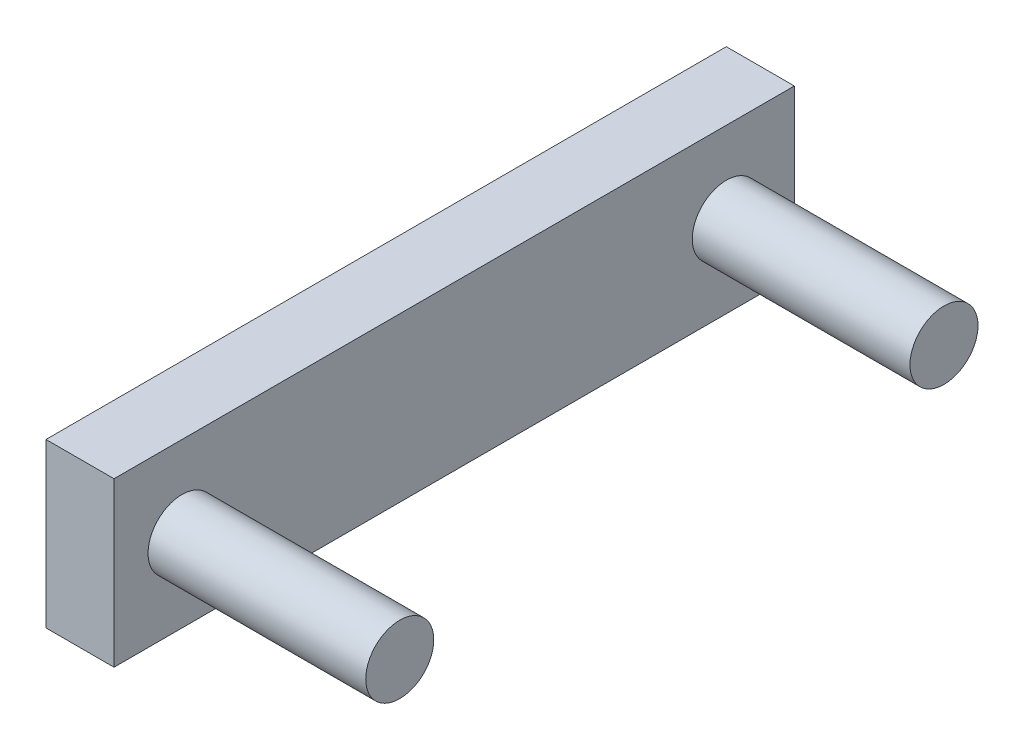
ISO-10303-21;
HEADER;
FILE_DESCRIPTION(('STEP AP214'),'2;1');
FILE_NAME('part.step','',(''),(''),'','','');
FILE_SCHEMA(('AUTOMOTIVE_DESIGN { 1 0 10303 214 1 1 1 1 }'));
ENDSEC;
DATA;
#1=APPLICATION_CONTEXT('core data for automotive mechanical design processes');
#2=APPLICATION_PROTOCOL_DEFINITION('international standard','automotive_design',2000,#1);
#3=PRODUCT_CONTEXT('',#1,'mechanical');
#4=PRODUCT('Part','Part','',(#3));
#5=PRODUCT_RELATED_PRODUCT_CATEGORY('part','',(#4));
#6=PRODUCT_DEFINITION_FORMATION('','',#4);
#7=PRODUCT_DEFINITION_CONTEXT('part definition',#1,'design');
#8=PRODUCT_DEFINITION('design','',#6,#7);
#9=PRODUCT_DEFINITION_SHAPE('','',#8);
#10=(LENGTH_UNIT() NAMED_UNIT(*) SI_UNIT(.MILLI.,.METRE.));
#11=(NAMED_UNIT(*) PLANE_ANGLE_UNIT() SI_UNIT($,.RADIAN.));
#12=(NAMED_UNIT(*) SI_UNIT($,.STERADIAN.) SOLID_ANGLE_UNIT());
#13=UNCERTAINTY_MEASURE_WITH_UNIT(LENGTH_MEASURE(1.E-05),#10,'distance_accuracy_value','');
#14=(GEOMETRIC_REPRESENTATION_CONTEXT(3) GLOBAL_UNCERTAINTY_ASSIGNED_CONTEXT((#13)) GLOBAL_UNIT_ASSIGNED_CONTEXT((#10,
#11,#12)) REPRESENTATION_CONTEXT('',''));
#15=CARTESIAN_POINT('',(0.,0.,0.));
#16=DIRECTION('',(0.,0.,1.));
#17=DIRECTION('',(1.,0.,0.));
#18=AXIS2_PLACEMENT_3D('',#15,#16,#17);
#19=CARTESIAN_POINT('',(0.,12.,-25.));
#20=DIRECTION('',(1.,0.,0.));
#21=DIRECTION('',(0.,0.,-1.));
#22=AXIS2_PLACEMENT_3D('',#19,#20,#21);
#23=PLANE('',#22);
#24=DIRECTION('',(0.,0.,1.));
#25=VECTOR('',#24,1.);
#26=CARTESIAN_POINT('',(0.,0.,-25.));
#27=LINE('',#26,#25);
#28=CARTESIAN_POINT('',(0.,0.,-25.));
#29=VERTEX_POINT('',#28);
#30=CARTESIAN_POINT('',(0.,0.,25.));
#31=VERTEX_POINT('',#30);
#32=EDGE_CURVE('E113',#29,#31,#27,.T.);
#33=ORIENTED_EDGE('',*,*,#32,.T.);
#34=DIRECTION('',(0.,-1.,0.));
#35=VECTOR('',#34,1.);
#36=CARTESIAN_POINT('',(0.,12.,25.));
#37=LINE('',#36,#35);
#38=CARTESIAN_POINT('',(0.,12.,25.));
#39=VERTEX_POINT('',#38);
#40=EDGE_CURVE('E102',#39,#31,#37,.T.);
#41=ORIENTED_EDGE('',*,*,#40,.F.);
#42=DIRECTION('',(0.,0.,1.));
#43=VECTOR('',#42,1.);
#44=CARTESIAN_POINT('',(0.,12.,-25.));
#45=LINE('',#44,#43);
#46=CARTESIAN_POINT('',(0.,12.,-25.));
#47=VERTEX_POINT('',#46);
#48=EDGE_CURVE('E94',#47,#39,#45,.T.);
#49=ORIENTED_EDGE('',*,*,#48,.F.);
#50=DIRECTION('',(0.,-1.,0.));
#51=VECTOR('',#50,1.);
#52=CARTESIAN_POINT('',(0.,12.,-25.));
#53=LINE('',#52,#51);
#54=EDGE_CURVE('E109',#47,#29,#53,.T.);
#55=ORIENTED_EDGE('',*,*,#54,.T.);
#56=EDGE_LOOP('',(#33,#41,#49,#55));
#57=FACE_BOUND('',#56,.T.);
#58=ADVANCED_FACE('F41',(#57),#23,.F.);
#59=CARTESIAN_POINT('',(0.,12.,25.));
#60=DIRECTION('',(0.,0.,-1.));
#61=DIRECTION('',(-1.,0.,0.));
#62=AXIS2_PLACEMENT_3D('',#59,#60,#61);
#63=PLANE('',#62);
#64=DIRECTION('',(1.,0.,0.));
#65=VECTOR('',#64,1.);
#66=CARTESIAN_POINT('',(0.,0.,25.));
#67=LINE('',#66,#65);
#68=CARTESIAN_POINT('',(5.00000000000001,0.,25.));
#69=VERTEX_POINT('',#68);
#70=EDGE_CURVE('E100',#31,#69,#67,.T.);
#71=ORIENTED_EDGE('',*,*,#70,.T.);
#72=DIRECTION('',(0.,-1.,0.));
#73=VECTOR('',#72,1.);
#74=CARTESIAN_POINT('',(5.00000000000001,12.,25.));
#75=LINE('',#74,#73);
#76=CARTESIAN_POINT('',(5.00000000000001,12.,25.));
#77=VERTEX_POINT('',#76);
#78=EDGE_CURVE('E98',#77,#69,#75,.T.);
#79=ORIENTED_EDGE('',*,*,#78,.F.);
#80=DIRECTION('',(1.,0.,0.));
#81=VECTOR('',#80,1.);
#82=CARTESIAN_POINT('',(0.,12.,25.));
#83=LINE('',#82,#81);
#84=EDGE_CURVE('E89',#39,#77,#83,.T.);
#85=ORIENTED_EDGE('',*,*,#84,.F.);
#86=ORIENTED_EDGE('',*,*,#40,.T.);
#87=EDGE_LOOP('',(#71,#79,#85,#86));
#88=FACE_BOUND('',#87,.T.);
#89=ADVANCED_FACE('F99',(#88),#63,.F.);
#90=CARTESIAN_POINT('',(5.,12.,-25.));
#91=DIRECTION('',(-1.,0.,0.));
#92=DIRECTION('',(0.,0.,1.));
#93=AXIS2_PLACEMENT_3D('',#90,#91,#92);
#94=PLANE('',#93);
#95=CARTESIAN_POINT('',(5.00000000000001,6.,20.));
#96=DIRECTION('',(-1.,0.,0.));
#97=DIRECTION('',(0.,0.,1.));
#98=AXIS2_PLACEMENT_3D('',#95,#96,#97);
#99=CIRCLE('',#98,2.5);
#100=CARTESIAN_POINT('',(5.00000000000001,6.,22.5));
#101=VERTEX_POINT('',#100);
#102=EDGE_CURVE('E11',#101,#101,#99,.F.);
#103=ORIENTED_EDGE('',*,*,#102,.F.);
#104=EDGE_LOOP('',(#103));
#105=FACE_BOUND('',#104,.T.);
#106=CARTESIAN_POINT('',(5.,6.,-20.));
#107=DIRECTION('',(-1.,0.,0.));
#108=DIRECTION('',(0.,0.,1.));
#109=AXIS2_PLACEMENT_3D('',#106,#107,#108);
#110=CIRCLE('',#109,2.5);
#111=CARTESIAN_POINT('',(5.,6.,-17.5));
#112=VERTEX_POINT('',#111);
#113=EDGE_CURVE('E50',#112,#112,#110,.F.);
#114=ORIENTED_EDGE('',*,*,#113,.F.);
#115=EDGE_LOOP('',(#114));
#116=FACE_BOUND('',#115,.T.);
#117=DIRECTION('',(0.,0.,-1.));
#118=VECTOR('',#117,1.);
#119=CARTESIAN_POINT('',(5.,0.,-25.));
#120=LINE('',#119,#118);
#121=CARTESIAN_POINT('',(5.,0.,-25.));
#122=VERTEX_POINT('',#121);
#123=EDGE_CURVE('E75',#69,#122,#120,.T.);
#124=ORIENTED_EDGE('',*,*,#123,.T.);
#125=DIRECTION('',(0.,-1.,0.));
#126=VECTOR('',#125,1.);
#127=CARTESIAN_POINT('',(5.,12.,-25.));
#128=LINE('',#127,#126);
#129=CARTESIAN_POINT('',(5.,12.,-25.));
#130=VERTEX_POINT('',#129);
#131=EDGE_CURVE('E103',#130,#122,#128,.T.);
#132=ORIENTED_EDGE('',*,*,#131,.F.);
#133=DIRECTION('',(0.,0.,-1.));
#134=VECTOR('',#133,1.);
#135=CARTESIAN_POINT('',(5.,12.,-25.));
#136=LINE('',#135,#134);
#137=EDGE_CURVE('E92',#77,#130,#136,.T.);
#138=ORIENTED_EDGE('',*,*,#137,.F.);
#139=ORIENTED_EDGE('',*,*,#78,.T.);
#140=EDGE_LOOP('',(#124,#132,#138,#139));
#141=FACE_BOUND('',#140,.T.);
#142=ADVANCED_FACE('F105',(#105,#116,#141),#94,.F.);
#143=CARTESIAN_POINT('',(0.,12.,-25.));
#144=DIRECTION('',(0.,0.,1.));
#145=DIRECTION('',(1.,0.,0.));
#146=AXIS2_PLACEMENT_3D('',#143,#144,#145);
#147=PLANE('',#146);
#148=DIRECTION('',(-1.,0.,0.));
#149=VECTOR('',#148,1.);
#150=CARTESIAN_POINT('',(0.,0.,-25.));
#151=LINE('',#150,#149);
#152=EDGE_CURVE('E81',#122,#29,#151,.T.);
#153=ORIENTED_EDGE('',*,*,#152,.T.);
#154=ORIENTED_EDGE('',*,*,#54,.F.);
#155=DIRECTION('',(-1.,0.,0.));
#156=VECTOR('',#155,1.);
#157=CARTESIAN_POINT('',(0.,12.,-25.));
#158=LINE('',#157,#156);
#159=EDGE_CURVE('E58',#130,#47,#158,.T.);
#160=ORIENTED_EDGE('',*,*,#159,.F.);
#161=ORIENTED_EDGE('',*,*,#131,.T.);
#162=EDGE_LOOP('',(#153,#154,#160,#161));
#163=FACE_BOUND('',#162,.T.);
#164=ADVANCED_FACE('F136',(#163),#147,.F.);
#165=CARTESIAN_POINT('',(0.,12.,0.));
#166=DIRECTION('',(0.,1.,0.));
#167=DIRECTION('',(0.,0.,1.));
#168=AXIS2_PLACEMENT_3D('',#165,#166,#167);
#169=PLANE('',#168);
#170=ORIENTED_EDGE('',*,*,#48,.T.);
#171=ORIENTED_EDGE('',*,*,#84,.T.);
#172=ORIENTED_EDGE('',*,*,#137,.T.);
#173=ORIENTED_EDGE('',*,*,#159,.T.);
#174=EDGE_LOOP('',(#170,#171,#172,#173));
#175=FACE_BOUND('',#174,.T.);
#176=ADVANCED_FACE('F90',(#175),#169,.T.);
#177=CARTESIAN_POINT('',(0.,0.,0.));
#178=DIRECTION('',(0.,1.,0.));
#179=DIRECTION('',(0.,0.,1.));
#180=AXIS2_PLACEMENT_3D('',#177,#178,#179);
#181=PLANE('',#180);
#182=ORIENTED_EDGE('',*,*,#32,.F.);
#183=ORIENTED_EDGE('',*,*,#152,.F.);
#184=ORIENTED_EDGE('',*,*,#123,.F.);
#185=ORIENTED_EDGE('',*,*,#70,.F.);
#186=EDGE_LOOP('',(#182,#183,#184,#185));
#187=FACE_BOUND('',#186,.T.);
#188=ADVANCED_FACE('F151',(#187),#181,.F.);
#189=CARTESIAN_POINT('',(21.,6.,-20.));
#190=DIRECTION('',(-1.,0.,0.));
#191=DIRECTION('',(0.,0.,1.));
#192=AXIS2_PLACEMENT_3D('',#189,#190,#191);
#193=CYLINDRICAL_SURFACE('',#192,2.5);
#194=CARTESIAN_POINT('',(21.,6.,-20.));
#195=DIRECTION('',(1.,0.,0.));
#196=DIRECTION('',(0.,0.,-1.));
#197=AXIS2_PLACEMENT_3D('',#194,#195,#196);
#198=CIRCLE('',#197,2.5);
#199=CARTESIAN_POINT('',(21.,6.,-22.5));
#200=VERTEX_POINT('',#199);
#201=EDGE_CURVE('E117',#200,#200,#198,.T.);
#202=ORIENTED_EDGE('',*,*,#201,.F.);
#203=EDGE_LOOP('',(#202));
#204=FACE_BOUND('',#203,.T.);
#205=ORIENTED_EDGE('',*,*,#113,.T.);
#206=EDGE_LOOP('',(#205));
#207=FACE_BOUND('',#206,.T.);
#208=ADVANCED_FACE('F133',(#204,#207),#193,.T.);
#209=CARTESIAN_POINT('',(21.,6.,-20.));
#210=DIRECTION('',(1.,0.,0.));
#211=DIRECTION('',(0.,0.,-1.));
#212=AXIS2_PLACEMENT_3D('',#209,#210,#211);
#213=PLANE('',#212);
#214=ORIENTED_EDGE('',*,*,#201,.T.);
#215=EDGE_LOOP('',(#214));
#216=FACE_BOUND('',#215,.T.);
#217=ADVANCED_FACE('F158',(#216),#213,.T.);
#218=CARTESIAN_POINT('',(21.,6.,20.));
#219=DIRECTION('',(-1.,0.,0.));
#220=DIRECTION('',(0.,0.,1.));
#221=AXIS2_PLACEMENT_3D('',#218,#219,#220);
#222=CYLINDRICAL_SURFACE('',#221,2.5);
#223=CARTESIAN_POINT('',(21.,6.,20.));
#224=DIRECTION('',(1.,0.,0.));
#225=DIRECTION('',(0.,0.,1.));
#226=AXIS2_PLACEMENT_3D('',#223,#224,#225);
#227=CIRCLE('',#226,2.5);
#228=CARTESIAN_POINT('',(21.,6.,22.5));
#229=VERTEX_POINT('',#228);
#230=EDGE_CURVE('E177',#229,#229,#227,.T.);
#231=ORIENTED_EDGE('',*,*,#230,.F.);
#232=EDGE_LOOP('',(#231));
#233=FACE_BOUND('',#232,.T.);
#234=ORIENTED_EDGE('',*,*,#102,.T.);
#235=EDGE_LOOP('',(#234));
#236=FACE_BOUND('',#235,.T.);
#237=ADVANCED_FACE('F165',(#233,#236),#222,.T.);
#238=CARTESIAN_POINT('',(21.,6.,20.));
#239=DIRECTION('',(-1.,0.,0.));
#240=DIRECTION('',(0.,0.,1.));
#241=AXIS2_PLACEMENT_3D('',#238,#239,#240);
#242=PLANE('',#241);
#243=ORIENTED_EDGE('',*,*,#230,.T.);
#244=EDGE_LOOP('',(#243));
#245=FACE_BOUND('',#244,.T.);
#246=ADVANCED_FACE('F169',(#245),#242,.F.);
#247=CLOSED_SHELL('',(#58,#89,#142,#164,#176,#188,#208,#217,#237,#246));
#248=MANIFOLD_SOLID_BREP('B2',#247);
#249=ADVANCED_BREP_SHAPE_REPRESENTATION('',(#18,#248),#14);
#250=SHAPE_DEFINITION_REPRESENTATION(#9,#249);
ENDSEC;
END-ISO-10303-21;
